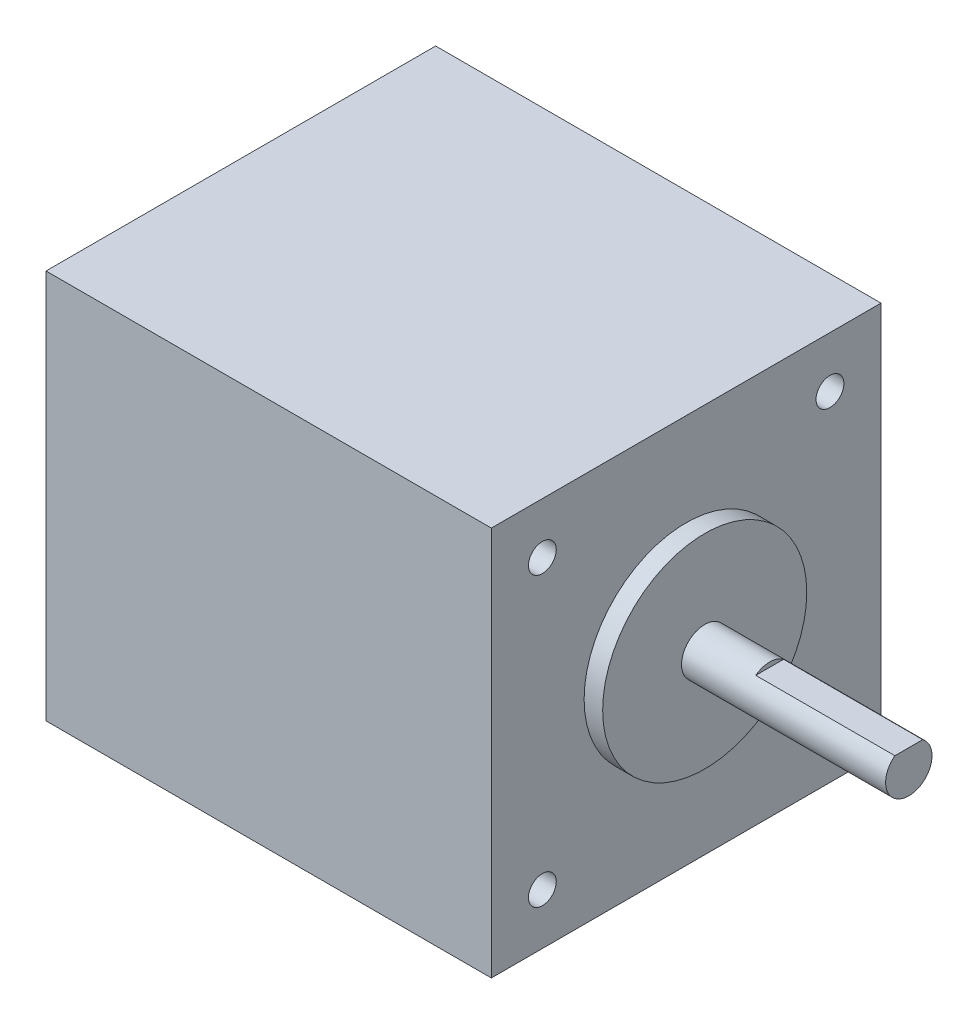
ISO-10303-21;
HEADER;
FILE_DESCRIPTION(('STEP AP214'),'2;1');
FILE_NAME('part.step','',(''),(''),'','','');
FILE_SCHEMA(('AUTOMOTIVE_DESIGN { 1 0 10303 214 1 1 1 1 }'));
ENDSEC;
DATA;
#1=APPLICATION_CONTEXT('core data for automotive mechanical design processes');
#2=APPLICATION_PROTOCOL_DEFINITION('international standard','automotive_design',2000,#1);
#3=PRODUCT_CONTEXT('',#1,'mechanical');
#4=PRODUCT('Part','Part','',(#3));
#5=PRODUCT_RELATED_PRODUCT_CATEGORY('part','',(#4));
#6=PRODUCT_DEFINITION_FORMATION('','',#4);
#7=PRODUCT_DEFINITION_CONTEXT('part definition',#1,'design');
#8=PRODUCT_DEFINITION('design','',#6,#7);
#9=PRODUCT_DEFINITION_SHAPE('','',#8);
#10=(LENGTH_UNIT() NAMED_UNIT(*) SI_UNIT(.MILLI.,.METRE.));
#11=(NAMED_UNIT(*) PLANE_ANGLE_UNIT() SI_UNIT($,.RADIAN.));
#12=(NAMED_UNIT(*) SI_UNIT($,.STERADIAN.) SOLID_ANGLE_UNIT());
#13=UNCERTAINTY_MEASURE_WITH_UNIT(LENGTH_MEASURE(1.E-05),#10,'distance_accuracy_value','');
#14=(GEOMETRIC_REPRESENTATION_CONTEXT(3) GLOBAL_UNCERTAINTY_ASSIGNED_CONTEXT((#13)) GLOBAL_UNIT_ASSIGNED_CONTEXT((#10,
#11,#12)) REPRESENTATION_CONTEXT('',''));
#15=CARTESIAN_POINT('',(0.,0.,0.));
#16=DIRECTION('',(0.,0.,1.));
#17=DIRECTION('',(1.,0.,0.));
#18=AXIS2_PLACEMENT_3D('',#15,#16,#17);
#19=CARTESIAN_POINT('',(72.,21.,-21.));
#20=DIRECTION('',(-1.,0.,0.));
#21=DIRECTION('',(0.,0.,1.));
#22=AXIS2_PLACEMENT_3D('',#19,#20,#21);
#23=CYLINDRICAL_SURFACE('',#22,2.5);
#24=CARTESIAN_POINT('',(50.,21.,-21.));
#25=DIRECTION('',(1.,0.,0.));
#26=DIRECTION('',(0.,0.,-1.));
#27=AXIS2_PLACEMENT_3D('',#24,#25,#26);
#28=CIRCLE('',#27,2.5);
#29=CARTESIAN_POINT('',(50.,21.,-23.5));
#30=VERTEX_POINT('',#29);
#31=EDGE_CURVE('E105',#30,#30,#28,.T.);
#32=ORIENTED_EDGE('',*,*,#31,.T.);
#33=EDGE_LOOP('',(#32));
#34=FACE_BOUND('',#33,.T.);
#35=DIRECTION('',(-1.,0.,0.));
#36=VECTOR('',#35,1.);
#37=CARTESIAN_POINT('',(72.,23.,-22.5));
#38=LINE('',#37,#36);
#39=CARTESIAN_POINT('',(72.,23.,-22.5));
#40=VERTEX_POINT('',#39);
#41=CARTESIAN_POINT('',(57.,23.,-22.5));
#42=VERTEX_POINT('',#41);
#43=EDGE_CURVE('E97',#40,#42,#38,.T.);
#44=ORIENTED_EDGE('',*,*,#43,.F.);
#45=CARTESIAN_POINT('',(72.,21.,-21.));
#46=DIRECTION('',(1.,0.,0.));
#47=DIRECTION('',(0.,0.,-1.));
#48=AXIS2_PLACEMENT_3D('',#45,#46,#47);
#49=CIRCLE('',#48,2.5);
#50=CARTESIAN_POINT('',(72.,23.,-19.5));
#51=VERTEX_POINT('',#50);
#52=EDGE_CURVE('E111',#51,#40,#49,.T.);
#53=ORIENTED_EDGE('',*,*,#52,.F.);
#54=DIRECTION('',(-1.,0.,0.));
#55=VECTOR('',#54,1.);
#56=CARTESIAN_POINT('',(72.,23.,-19.5));
#57=LINE('',#56,#55);
#58=CARTESIAN_POINT('',(57.,23.,-19.5));
#59=VERTEX_POINT('',#58);
#60=EDGE_CURVE('E51',#59,#51,#57,.F.);
#61=ORIENTED_EDGE('',*,*,#60,.F.);
#62=CARTESIAN_POINT('',(57.,21.,-21.));
#63=DIRECTION('',(1.,0.,0.));
#64=DIRECTION('',(0.,0.,-1.));
#65=AXIS2_PLACEMENT_3D('',#62,#63,#64);
#66=CIRCLE('',#65,2.5);
#67=EDGE_CURVE('E11',#42,#59,#66,.T.);
#68=ORIENTED_EDGE('',*,*,#67,.F.);
#69=EDGE_LOOP('',(#44,#53,#61,#68));
#70=FACE_BOUND('',#69,.T.);
#71=ADVANCED_FACE('F36',(#34,#70),#23,.T.);
#72=CARTESIAN_POINT('',(72.,21.,-21.));
#73=DIRECTION('',(1.,0.,0.));
#74=DIRECTION('',(0.,0.,-1.));
#75=AXIS2_PLACEMENT_3D('',#72,#73,#74);
#76=PLANE('',#75);
#77=ORIENTED_EDGE('',*,*,#52,.T.);
#78=DIRECTION('',(0.,0.,1.));
#79=VECTOR('',#78,1.);
#80=CARTESIAN_POINT('',(72.,23.,-21.));
#81=LINE('',#80,#79);
#82=EDGE_CURVE('E44',#40,#51,#81,.T.);
#83=ORIENTED_EDGE('',*,*,#82,.T.);
#84=EDGE_LOOP('',(#77,#83));
#85=FACE_BOUND('',#84,.T.);
#86=ADVANCED_FACE('F147',(#85),#76,.T.);
#87=CARTESIAN_POINT('',(50.,21.,-21.));
#88=DIRECTION('',(1.,0.,0.));
#89=DIRECTION('',(0.,0.,-1.));
#90=AXIS2_PLACEMENT_3D('',#87,#88,#89);
#91=PLANE('',#90);
#92=CARTESIAN_POINT('',(50.,21.,-21.));
#93=DIRECTION('',(1.,0.,0.));
#94=DIRECTION('',(0.,0.,-1.));
#95=AXIS2_PLACEMENT_3D('',#92,#93,#94);
#96=CIRCLE('',#95,11.);
#97=CARTESIAN_POINT('',(50.,21.,-32.));
#98=VERTEX_POINT('',#97);
#99=EDGE_CURVE('E116',#98,#98,#96,.T.);
#100=ORIENTED_EDGE('',*,*,#99,.T.);
#101=EDGE_LOOP('',(#100));
#102=FACE_BOUND('',#101,.T.);
#103=ORIENTED_EDGE('',*,*,#31,.F.);
#104=EDGE_LOOP('',(#103));
#105=FACE_BOUND('',#104,.T.);
#106=ADVANCED_FACE('F149',(#102,#105),#91,.T.);
#107=CARTESIAN_POINT('',(48.,0.,0.));
#108=DIRECTION('',(-1.,0.,0.));
#109=DIRECTION('',(0.,0.,1.));
#110=AXIS2_PLACEMENT_3D('',#107,#108,#109);
#111=PLANE('',#110);
#112=CARTESIAN_POINT('',(48.,5.49999999999999,-5.50000000000001));
#113=DIRECTION('',(1.,0.,0.));
#114=DIRECTION('',(0.,0.,-1.));
#115=AXIS2_PLACEMENT_3D('',#112,#113,#114);
#116=CIRCLE('',#115,1.5);
#117=CARTESIAN_POINT('',(48.,5.49999999999999,-7.00000000000001));
#118=VERTEX_POINT('',#117);
#119=EDGE_CURVE('E333',#118,#118,#116,.T.);
#120=ORIENTED_EDGE('',*,*,#119,.F.);
#121=EDGE_LOOP('',(#120));
#122=FACE_BOUND('',#121,.T.);
#123=CARTESIAN_POINT('',(48.,5.49999999999999,-36.5));
#124=DIRECTION('',(1.,0.,0.));
#125=DIRECTION('',(0.,0.,-1.));
#126=AXIS2_PLACEMENT_3D('',#123,#124,#125);
#127=CIRCLE('',#126,1.5);
#128=CARTESIAN_POINT('',(48.,5.49999999999999,-38.));
#129=VERTEX_POINT('',#128);
#130=EDGE_CURVE('E332',#129,#129,#127,.T.);
#131=ORIENTED_EDGE('',*,*,#130,.F.);
#132=EDGE_LOOP('',(#131));
#133=FACE_BOUND('',#132,.T.);
#134=CARTESIAN_POINT('',(48.,36.5,-36.5));
#135=DIRECTION('',(1.,0.,0.));
#136=DIRECTION('',(0.,0.,-1.));
#137=AXIS2_PLACEMENT_3D('',#134,#135,#136);
#138=CIRCLE('',#137,1.5);
#139=CARTESIAN_POINT('',(48.,36.5,-38.));
#140=VERTEX_POINT('',#139);
#141=EDGE_CURVE('E342',#140,#140,#138,.T.);
#142=ORIENTED_EDGE('',*,*,#141,.F.);
#143=EDGE_LOOP('',(#142));
#144=FACE_BOUND('',#143,.T.);
#145=CARTESIAN_POINT('',(48.,36.5,-5.50000000000001));
#146=DIRECTION('',(1.,0.,0.));
#147=DIRECTION('',(0.,0.,-1.));
#148=AXIS2_PLACEMENT_3D('',#145,#146,#147);
#149=CIRCLE('',#148,1.5);
#150=CARTESIAN_POINT('',(48.,36.5,-7.00000000000001));
#151=VERTEX_POINT('',#150);
#152=EDGE_CURVE('E347',#151,#151,#149,.T.);
#153=ORIENTED_EDGE('',*,*,#152,.F.);
#154=EDGE_LOOP('',(#153));
#155=FACE_BOUND('',#154,.T.);
#156=DIRECTION('',(0.,-1.,0.));
#157=VECTOR('',#156,1.);
#158=CARTESIAN_POINT('',(48.,0.,0.));
#159=LINE('',#158,#157);
#160=CARTESIAN_POINT('',(48.,42.,0.));
#161=VERTEX_POINT('',#160);
#162=CARTESIAN_POINT('',(48.,0.,0.));
#163=VERTEX_POINT('',#162);
#164=EDGE_CURVE('E122',#161,#163,#159,.T.);
#165=ORIENTED_EDGE('',*,*,#164,.T.);
#166=DIRECTION('',(0.,0.,-1.));
#167=VECTOR('',#166,1.);
#168=CARTESIAN_POINT('',(48.,0.,0.));
#169=LINE('',#168,#167);
#170=CARTESIAN_POINT('',(48.,0.,-42.));
#171=VERTEX_POINT('',#170);
#172=EDGE_CURVE('E89',#163,#171,#169,.T.);
#173=ORIENTED_EDGE('',*,*,#172,.T.);
#174=DIRECTION('',(0.,1.,0.));
#175=VECTOR('',#174,1.);
#176=CARTESIAN_POINT('',(48.,0.,-42.));
#177=LINE('',#176,#175);
#178=CARTESIAN_POINT('',(48.,42.,-42.));
#179=VERTEX_POINT('',#178);
#180=EDGE_CURVE('E125',#171,#179,#177,.T.);
#181=ORIENTED_EDGE('',*,*,#180,.T.);
#182=DIRECTION('',(0.,0.,1.));
#183=VECTOR('',#182,1.);
#184=CARTESIAN_POINT('',(48.,42.,0.));
#185=LINE('',#184,#183);
#186=EDGE_CURVE('E60',#179,#161,#185,.T.);
#187=ORIENTED_EDGE('',*,*,#186,.T.);
#188=EDGE_LOOP('',(#165,#173,#181,#187));
#189=FACE_BOUND('',#188,.T.);
#190=CARTESIAN_POINT('',(48.,21.,-21.));
#191=DIRECTION('',(-1.,0.,0.));
#192=DIRECTION('',(0.,0.,1.));
#193=AXIS2_PLACEMENT_3D('',#190,#191,#192);
#194=CIRCLE('',#193,11.);
#195=CARTESIAN_POINT('',(48.,21.,-10.));
#196=VERTEX_POINT('',#195);
#197=EDGE_CURVE('E144',#196,#196,#194,.F.);
#198=ORIENTED_EDGE('',*,*,#197,.F.);
#199=EDGE_LOOP('',(#198));
#200=FACE_BOUND('',#199,.T.);
#201=ADVANCED_FACE('F155',(#122,#133,#144,#155,#189,#200),#111,.F.);
#202=CARTESIAN_POINT('',(48.,0.,0.));
#203=DIRECTION('',(0.,0.,-1.));
#204=DIRECTION('',(-1.,0.,0.));
#205=AXIS2_PLACEMENT_3D('',#202,#203,#204);
#206=PLANE('',#205);
#207=DIRECTION('',(0.,-1.,0.));
#208=VECTOR('',#207,1.);
#209=CARTESIAN_POINT('',(0.,0.,0.));
#210=LINE('',#209,#208);
#211=CARTESIAN_POINT('',(0.,42.,0.));
#212=VERTEX_POINT('',#211);
#213=CARTESIAN_POINT('',(0.,0.,0.));
#214=VERTEX_POINT('',#213);
#215=EDGE_CURVE('E121',#212,#214,#210,.T.);
#216=ORIENTED_EDGE('',*,*,#215,.T.);
#217=DIRECTION('',(-1.,0.,0.));
#218=VECTOR('',#217,1.);
#219=CARTESIAN_POINT('',(48.,0.,0.));
#220=LINE('',#219,#218);
#221=EDGE_CURVE('E142',#163,#214,#220,.T.);
#222=ORIENTED_EDGE('',*,*,#221,.F.);
#223=ORIENTED_EDGE('',*,*,#164,.F.);
#224=DIRECTION('',(-1.,0.,0.));
#225=VECTOR('',#224,1.);
#226=CARTESIAN_POINT('',(48.,42.,0.));
#227=LINE('',#226,#225);
#228=EDGE_CURVE('E128',#161,#212,#227,.T.);
#229=ORIENTED_EDGE('',*,*,#228,.T.);
#230=EDGE_LOOP('',(#216,#222,#223,#229));
#231=FACE_BOUND('',#230,.T.);
#232=ADVANCED_FACE('F38',(#231),#206,.F.);
#233=CARTESIAN_POINT('',(48.,0.,0.));
#234=DIRECTION('',(0.,1.,0.));
#235=DIRECTION('',(0.,0.,1.));
#236=AXIS2_PLACEMENT_3D('',#233,#234,#235);
#237=PLANE('',#236);
#238=DIRECTION('',(0.,0.,-1.));
#239=VECTOR('',#238,1.);
#240=CARTESIAN_POINT('',(0.,0.,0.));
#241=LINE('',#240,#239);
#242=CARTESIAN_POINT('',(0.,0.,-42.));
#243=VERTEX_POINT('',#242);
#244=EDGE_CURVE('E131',#214,#243,#241,.T.);
#245=ORIENTED_EDGE('',*,*,#244,.T.);
#246=DIRECTION('',(-1.,0.,0.));
#247=VECTOR('',#246,1.);
#248=CARTESIAN_POINT('',(48.,0.,-42.));
#249=LINE('',#248,#247);
#250=EDGE_CURVE('E139',#171,#243,#249,.T.);
#251=ORIENTED_EDGE('',*,*,#250,.F.);
#252=ORIENTED_EDGE('',*,*,#172,.F.);
#253=ORIENTED_EDGE('',*,*,#221,.T.);
#254=EDGE_LOOP('',(#245,#251,#252,#253));
#255=FACE_BOUND('',#254,.T.);
#256=ADVANCED_FACE('F179',(#255),#237,.F.);
#257=CARTESIAN_POINT('',(48.,0.,-42.));
#258=DIRECTION('',(0.,0.,1.));
#259=DIRECTION('',(1.,0.,0.));
#260=AXIS2_PLACEMENT_3D('',#257,#258,#259);
#261=PLANE('',#260);
#262=DIRECTION('',(0.,1.,0.));
#263=VECTOR('',#262,1.);
#264=CARTESIAN_POINT('',(0.,0.,-42.));
#265=LINE('',#264,#263);
#266=CARTESIAN_POINT('',(0.,42.,-42.));
#267=VERTEX_POINT('',#266);
#268=EDGE_CURVE('E133',#243,#267,#265,.T.);
#269=ORIENTED_EDGE('',*,*,#268,.T.);
#270=DIRECTION('',(-1.,0.,0.));
#271=VECTOR('',#270,1.);
#272=CARTESIAN_POINT('',(48.,42.,-42.));
#273=LINE('',#272,#271);
#274=EDGE_CURVE('E137',#179,#267,#273,.T.);
#275=ORIENTED_EDGE('',*,*,#274,.F.);
#276=ORIENTED_EDGE('',*,*,#180,.F.);
#277=ORIENTED_EDGE('',*,*,#250,.T.);
#278=EDGE_LOOP('',(#269,#275,#276,#277));
#279=FACE_BOUND('',#278,.T.);
#280=ADVANCED_FACE('F177',(#279),#261,.F.);
#281=CARTESIAN_POINT('',(48.,42.,0.));
#282=DIRECTION('',(0.,-1.,0.));
#283=DIRECTION('',(0.,0.,-1.));
#284=AXIS2_PLACEMENT_3D('',#281,#282,#283);
#285=PLANE('',#284);
#286=DIRECTION('',(0.,0.,1.));
#287=VECTOR('',#286,1.);
#288=CARTESIAN_POINT('',(0.,42.,0.));
#289=LINE('',#288,#287);
#290=EDGE_CURVE('E81',#267,#212,#289,.T.);
#291=ORIENTED_EDGE('',*,*,#290,.T.);
#292=ORIENTED_EDGE('',*,*,#228,.F.);
#293=ORIENTED_EDGE('',*,*,#186,.F.);
#294=ORIENTED_EDGE('',*,*,#274,.T.);
#295=EDGE_LOOP('',(#291,#292,#293,#294));
#296=FACE_BOUND('',#295,.T.);
#297=ADVANCED_FACE('F173',(#296),#285,.F.);
#298=CARTESIAN_POINT('',(0.,0.,0.));
#299=DIRECTION('',(-1.,0.,0.));
#300=DIRECTION('',(0.,0.,1.));
#301=AXIS2_PLACEMENT_3D('',#298,#299,#300);
#302=PLANE('',#301);
#303=ORIENTED_EDGE('',*,*,#215,.F.);
#304=ORIENTED_EDGE('',*,*,#290,.F.);
#305=ORIENTED_EDGE('',*,*,#268,.F.);
#306=ORIENTED_EDGE('',*,*,#244,.F.);
#307=EDGE_LOOP('',(#303,#304,#305,#306));
#308=FACE_BOUND('',#307,.T.);
#309=ADVANCED_FACE('F166',(#308),#302,.T.);
#310=CARTESIAN_POINT('',(50.,21.,-21.));
#311=DIRECTION('',(-1.,0.,0.));
#312=DIRECTION('',(0.,0.,1.));
#313=AXIS2_PLACEMENT_3D('',#310,#311,#312);
#314=CYLINDRICAL_SURFACE('',#313,11.);
#315=ORIENTED_EDGE('',*,*,#99,.F.);
#316=EDGE_LOOP('',(#315));
#317=FACE_BOUND('',#316,.T.);
#318=ORIENTED_EDGE('',*,*,#197,.T.);
#319=EDGE_LOOP('',(#318));
#320=FACE_BOUND('',#319,.T.);
#321=ADVANCED_FACE('F163',(#317,#320),#314,.T.);
#322=CARTESIAN_POINT('',(57.,25.,-25.5021853861141));
#323=DIRECTION('',(1.,0.,0.));
#324=DIRECTION('',(0.,0.,-1.));
#325=AXIS2_PLACEMENT_3D('',#322,#323,#324);
#326=PLANE('',#325);
#327=ORIENTED_EDGE('',*,*,#67,.T.);
#328=DIRECTION('',(0.,0.,1.));
#329=VECTOR('',#328,1.);
#330=CARTESIAN_POINT('',(57.,23.,-25.5021853861141));
#331=LINE('',#330,#329);
#332=EDGE_CURVE('E100',#42,#59,#331,.T.);
#333=ORIENTED_EDGE('',*,*,#332,.F.);
#334=EDGE_LOOP('',(#327,#333));
#335=FACE_BOUND('',#334,.T.);
#336=ADVANCED_FACE('F108',(#335),#326,.T.);
#337=CARTESIAN_POINT('',(0.,23.,0.));
#338=DIRECTION('',(0.,1.,0.));
#339=DIRECTION('',(0.,0.,1.));
#340=AXIS2_PLACEMENT_3D('',#337,#338,#339);
#341=PLANE('',#340);
#342=ORIENTED_EDGE('',*,*,#43,.T.);
#343=ORIENTED_EDGE('',*,*,#332,.T.);
#344=ORIENTED_EDGE('',*,*,#60,.T.);
#345=ORIENTED_EDGE('',*,*,#82,.F.);
#346=EDGE_LOOP('',(#342,#343,#344,#345));
#347=FACE_BOUND('',#346,.T.);
#348=ADVANCED_FACE('F99',(#347),#341,.T.);
#349=CARTESIAN_POINT('',(43.5,36.5,-5.50000000000001));
#350=DIRECTION('',(1.,0.,0.));
#351=DIRECTION('',(0.,0.,-1.));
#352=AXIS2_PLACEMENT_3D('',#349,#350,#351);
#353=CYLINDRICAL_SURFACE('',#352,1.5);
#354=CARTESIAN_POINT('',(43.5,36.5,-5.50000000000001));
#355=DIRECTION('',(1.,0.,0.));
#356=DIRECTION('',(0.,0.,-1.));
#357=AXIS2_PLACEMENT_3D('',#354,#355,#356);
#358=CIRCLE('',#357,1.5);
#359=CARTESIAN_POINT('',(43.5,36.5,-7.00000000000001));
#360=VERTEX_POINT('',#359);
#361=EDGE_CURVE('E109',#360,#360,#358,.T.);
#362=ORIENTED_EDGE('',*,*,#361,.F.);
#363=EDGE_LOOP('',(#362));
#364=FACE_BOUND('',#363,.T.);
#365=ORIENTED_EDGE('',*,*,#152,.T.);
#366=EDGE_LOOP('',(#365));
#367=FACE_BOUND('',#366,.T.);
#368=ADVANCED_FACE('F235',(#364,#367),#353,.F.);
#369=CARTESIAN_POINT('',(43.5,0.,0.));
#370=DIRECTION('',(1.,0.,0.));
#371=DIRECTION('',(0.,0.,-1.));
#372=AXIS2_PLACEMENT_3D('',#369,#370,#371);
#373=PLANE('',#372);
#374=ORIENTED_EDGE('',*,*,#361,.T.);
#375=EDGE_LOOP('',(#374));
#376=FACE_BOUND('',#375,.T.);
#377=ADVANCED_FACE('F243',(#376),#373,.T.);
#378=CARTESIAN_POINT('',(43.5,36.5,-36.5));
#379=DIRECTION('',(1.,0.,0.));
#380=DIRECTION('',(0.,0.,-1.));
#381=AXIS2_PLACEMENT_3D('',#378,#379,#380);
#382=CYLINDRICAL_SURFACE('',#381,1.5);
#383=CARTESIAN_POINT('',(43.5,36.5,-36.5));
#384=DIRECTION('',(1.,0.,0.));
#385=DIRECTION('',(0.,0.,-1.));
#386=AXIS2_PLACEMENT_3D('',#383,#384,#385);
#387=CIRCLE('',#386,1.5);
#388=CARTESIAN_POINT('',(43.5,36.5,-38.));
#389=VERTEX_POINT('',#388);
#390=EDGE_CURVE('E344',#389,#389,#387,.T.);
#391=ORIENTED_EDGE('',*,*,#390,.F.);
#392=EDGE_LOOP('',(#391));
#393=FACE_BOUND('',#392,.T.);
#394=ORIENTED_EDGE('',*,*,#141,.T.);
#395=EDGE_LOOP('',(#394));
#396=FACE_BOUND('',#395,.T.);
#397=ADVANCED_FACE('F250',(#393,#396),#382,.F.);
#398=CARTESIAN_POINT('',(43.5,0.,0.));
#399=DIRECTION('',(1.,0.,0.));
#400=DIRECTION('',(0.,0.,-1.));
#401=AXIS2_PLACEMENT_3D('',#398,#399,#400);
#402=PLANE('',#401);
#403=ORIENTED_EDGE('',*,*,#390,.T.);
#404=EDGE_LOOP('',(#403));
#405=FACE_BOUND('',#404,.T.);
#406=ADVANCED_FACE('F258',(#405),#402,.T.);
#407=CARTESIAN_POINT('',(43.5,5.49999999999999,-36.5));
#408=DIRECTION('',(1.,0.,0.));
#409=DIRECTION('',(0.,0.,-1.));
#410=AXIS2_PLACEMENT_3D('',#407,#408,#409);
#411=CYLINDRICAL_SURFACE('',#410,1.5);
#412=CARTESIAN_POINT('',(43.5,5.49999999999999,-36.5));
#413=DIRECTION('',(1.,0.,0.));
#414=DIRECTION('',(0.,0.,-1.));
#415=AXIS2_PLACEMENT_3D('',#412,#413,#414);
#416=CIRCLE('',#415,1.5);
#417=CARTESIAN_POINT('',(43.5,5.49999999999999,-38.));
#418=VERTEX_POINT('',#417);
#419=EDGE_CURVE('E336',#418,#418,#416,.T.);
#420=ORIENTED_EDGE('',*,*,#419,.F.);
#421=EDGE_LOOP('',(#420));
#422=FACE_BOUND('',#421,.T.);
#423=ORIENTED_EDGE('',*,*,#130,.T.);
#424=EDGE_LOOP('',(#423));
#425=FACE_BOUND('',#424,.T.);
#426=ADVANCED_FACE('F266',(#422,#425),#411,.F.);
#427=CARTESIAN_POINT('',(43.5,0.,0.));
#428=DIRECTION('',(1.,0.,0.));
#429=DIRECTION('',(0.,0.,-1.));
#430=AXIS2_PLACEMENT_3D('',#427,#428,#429);
#431=PLANE('',#430);
#432=ORIENTED_EDGE('',*,*,#419,.T.);
#433=EDGE_LOOP('',(#432));
#434=FACE_BOUND('',#433,.T.);
#435=ADVANCED_FACE('F274',(#434),#431,.T.);
#436=CARTESIAN_POINT('',(43.5,5.49999999999999,-5.50000000000001));
#437=DIRECTION('',(1.,0.,0.));
#438=DIRECTION('',(0.,0.,-1.));
#439=AXIS2_PLACEMENT_3D('',#436,#437,#438);
#440=CYLINDRICAL_SURFACE('',#439,1.5);
#441=CARTESIAN_POINT('',(43.5,5.49999999999999,-5.50000000000001));
#442=DIRECTION('',(1.,0.,0.));
#443=DIRECTION('',(0.,0.,-1.));
#444=AXIS2_PLACEMENT_3D('',#441,#442,#443);
#445=CIRCLE('',#444,1.5);
#446=CARTESIAN_POINT('',(43.5,5.49999999999999,-7.00000000000001));
#447=VERTEX_POINT('',#446);
#448=EDGE_CURVE('E331',#447,#447,#445,.T.);
#449=ORIENTED_EDGE('',*,*,#448,.F.);
#450=EDGE_LOOP('',(#449));
#451=FACE_BOUND('',#450,.T.);
#452=ORIENTED_EDGE('',*,*,#119,.T.);
#453=EDGE_LOOP('',(#452));
#454=FACE_BOUND('',#453,.T.);
#455=ADVANCED_FACE('F282',(#451,#454),#440,.F.);
#456=CARTESIAN_POINT('',(43.5,0.,0.));
#457=DIRECTION('',(1.,0.,0.));
#458=DIRECTION('',(0.,0.,-1.));
#459=AXIS2_PLACEMENT_3D('',#456,#457,#458);
#460=PLANE('',#459);
#461=ORIENTED_EDGE('',*,*,#448,.T.);
#462=EDGE_LOOP('',(#461));
#463=FACE_BOUND('',#462,.T.);
#464=ADVANCED_FACE('F290',(#463),#460,.T.);
#465=CLOSED_SHELL('',(#71,#86,#106,#201,#232,#256,#280,#297,#309,#321,#336,#348,#368,#377,#397,
#406,#426,#435,#455,#464));
#466=MANIFOLD_SOLID_BREP('B2',#465);
#467=ADVANCED_BREP_SHAPE_REPRESENTATION('',(#18,#466),#14);
#468=SHAPE_DEFINITION_REPRESENTATION(#9,#467);
ENDSEC;
END-ISO-10303-21;
